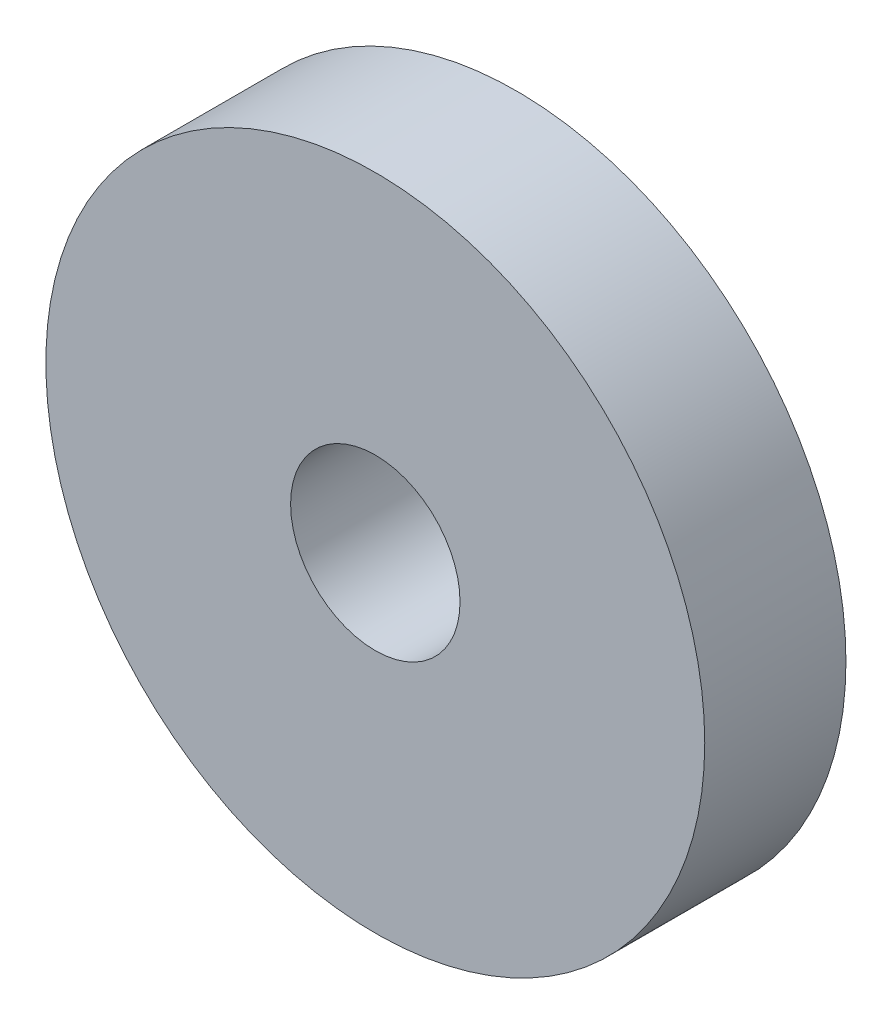
ISO-10303-21;
HEADER;
FILE_DESCRIPTION(('STEP AP214'),'2;1');
FILE_NAME('part.step','',(''),(''),'','','');
FILE_SCHEMA(('AUTOMOTIVE_DESIGN { 1 0 10303 214 1 1 1 1 }'));
ENDSEC;
DATA;
#1=APPLICATION_CONTEXT('core data for automotive mechanical design processes');
#2=APPLICATION_PROTOCOL_DEFINITION('international standard','automotive_design',2000,#1);
#3=PRODUCT_CONTEXT('',#1,'mechanical');
#4=PRODUCT('Part','Part','',(#3));
#5=PRODUCT_RELATED_PRODUCT_CATEGORY('part','',(#4));
#6=PRODUCT_DEFINITION_FORMATION('','',#4);
#7=PRODUCT_DEFINITION_CONTEXT('part definition',#1,'design');
#8=PRODUCT_DEFINITION('design','',#6,#7);
#9=PRODUCT_DEFINITION_SHAPE('','',#8);
#10=(LENGTH_UNIT() NAMED_UNIT(*) SI_UNIT(.MILLI.,.METRE.));
#11=(NAMED_UNIT(*) PLANE_ANGLE_UNIT() SI_UNIT($,.RADIAN.));
#12=(NAMED_UNIT(*) SI_UNIT($,.STERADIAN.) SOLID_ANGLE_UNIT());
#13=UNCERTAINTY_MEASURE_WITH_UNIT(LENGTH_MEASURE(1.E-05),#10,'distance_accuracy_value','');
#14=(GEOMETRIC_REPRESENTATION_CONTEXT(3) GLOBAL_UNCERTAINTY_ASSIGNED_CONTEXT((#13)) GLOBAL_UNIT_ASSIGNED_CONTEXT((#10,
#11,#12)) REPRESENTATION_CONTEXT('',''));
#15=CARTESIAN_POINT('',(0.,0.,0.));
#16=DIRECTION('',(0.,0.,1.));
#17=DIRECTION('',(1.,0.,0.));
#18=AXIS2_PLACEMENT_3D('',#15,#16,#17);
#19=CARTESIAN_POINT('',(0.,0.,136.));
#20=DIRECTION('',(0.,0.,-1.));
#21=DIRECTION('',(-1.,0.,0.));
#22=AXIS2_PLACEMENT_3D('',#19,#20,#21);
#23=CYLINDRICAL_SURFACE('',#22,35.);
#24=CARTESIAN_POINT('',(0.,0.,136.));
#25=DIRECTION('',(0.,0.,1.));
#26=DIRECTION('',(1.,0.,0.));
#27=AXIS2_PLACEMENT_3D('',#24,#25,#26);
#28=CIRCLE('',#27,35.);
#29=CARTESIAN_POINT('',(35.,0.,136.));
#30=VERTEX_POINT('',#29);
#31=EDGE_CURVE('E10',#30,#30,#28,.T.);
#32=ORIENTED_EDGE('',*,*,#31,.F.);
#33=EDGE_LOOP('',(#32));
#34=FACE_BOUND('',#33,.T.);
#35=CARTESIAN_POINT('',(0.,0.,121.));
#36=DIRECTION('',(0.,0.,1.));
#37=DIRECTION('',(1.,0.,0.));
#38=AXIS2_PLACEMENT_3D('',#35,#36,#37);
#39=CIRCLE('',#38,35.);
#40=CARTESIAN_POINT('',(35.,0.,121.));
#41=VERTEX_POINT('',#40);
#42=EDGE_CURVE('E48',#41,#41,#39,.T.);
#43=ORIENTED_EDGE('',*,*,#42,.T.);
#44=EDGE_LOOP('',(#43));
#45=FACE_BOUND('',#44,.T.);
#46=ADVANCED_FACE('F45',(#34,#45),#23,.T.);
#47=CARTESIAN_POINT('',(0.,0.,136.));
#48=DIRECTION('',(0.,0.,1.));
#49=DIRECTION('',(1.,0.,0.));
#50=AXIS2_PLACEMENT_3D('',#47,#48,#49);
#51=PLANE('',#50);
#52=CARTESIAN_POINT('',(0.,0.,136.));
#53=DIRECTION('',(0.,0.,1.));
#54=DIRECTION('',(1.,0.,0.));
#55=AXIS2_PLACEMENT_3D('',#52,#53,#54);
#56=CIRCLE('',#55,9.);
#57=CARTESIAN_POINT('',(9.,0.,136.));
#58=VERTEX_POINT('',#57);
#59=EDGE_CURVE('E106',#58,#58,#56,.T.);
#60=ORIENTED_EDGE('',*,*,#59,.F.);
#61=EDGE_LOOP('',(#60));
#62=FACE_BOUND('',#61,.T.);
#63=ORIENTED_EDGE('',*,*,#31,.T.);
#64=EDGE_LOOP('',(#63));
#65=FACE_BOUND('',#64,.T.);
#66=ADVANCED_FACE('F121',(#62,#65),#51,.T.);
#67=CARTESIAN_POINT('',(0.,0.,121.));
#68=DIRECTION('',(0.,0.,1.));
#69=DIRECTION('',(1.,0.,0.));
#70=AXIS2_PLACEMENT_3D('',#67,#68,#69);
#71=PLANE('',#70);
#72=CARTESIAN_POINT('',(0.,0.,121.));
#73=DIRECTION('',(0.,0.,-1.));
#74=DIRECTION('',(-1.,0.,0.));
#75=AXIS2_PLACEMENT_3D('',#72,#73,#74);
#76=CIRCLE('',#75,9.);
#77=CARTESIAN_POINT('',(-9.,0.,121.));
#78=VERTEX_POINT('',#77);
#79=EDGE_CURVE('E110',#78,#78,#76,.T.);
#80=ORIENTED_EDGE('',*,*,#79,.F.);
#81=EDGE_LOOP('',(#80));
#82=FACE_BOUND('',#81,.T.);
#83=CARTESIAN_POINT('',(11.7346024862847,-22.0160778930827,121.));
#84=DIRECTION('',(0.,0.,1.));
#85=DIRECTION('',(1.,0.,0.));
#86=AXIS2_PLACEMENT_3D('',#83,#84,#85);
#87=CIRCLE('',#86,4.);
#88=CARTESIAN_POINT('',(15.7346024862847,-22.0160778930827,121.));
#89=VERTEX_POINT('',#88);
#90=EDGE_CURVE('E78',#89,#89,#87,.F.);
#91=ORIENTED_EDGE('',*,*,#90,.F.);
#92=EDGE_LOOP('',(#91));
#93=FACE_BOUND('',#92,.T.);
#94=CARTESIAN_POINT('',(-11.7346024862847,-22.0160778930827,121.));
#95=DIRECTION('',(0.,0.,1.));
#96=DIRECTION('',(1.,0.,0.));
#97=AXIS2_PLACEMENT_3D('',#94,#95,#96);
#98=CIRCLE('',#97,4.);
#99=CARTESIAN_POINT('',(-7.73460248628473,-22.0160778930827,121.));
#100=VERTEX_POINT('',#99);
#101=EDGE_CURVE('E74',#100,#100,#98,.F.);
#102=ORIENTED_EDGE('',*,*,#101,.F.);
#103=EDGE_LOOP('',(#102));
#104=FACE_BOUND('',#103,.T.);
#105=CARTESIAN_POINT('',(-13.1267829415376,21.2154696132601,121.));
#106=DIRECTION('',(0.,0.,1.));
#107=DIRECTION('',(1.,0.,0.));
#108=AXIS2_PLACEMENT_3D('',#105,#106,#107);
#109=CIRCLE('',#108,4.);
#110=CARTESIAN_POINT('',(-9.12678294153757,21.2154696132601,121.));
#111=VERTEX_POINT('',#110);
#112=EDGE_CURVE('E70',#111,#111,#109,.F.);
#113=ORIENTED_EDGE('',*,*,#112,.F.);
#114=EDGE_LOOP('',(#113));
#115=FACE_BOUND('',#114,.T.);
#116=CARTESIAN_POINT('',(13.1267829415376,21.2154696132601,121.));
#117=DIRECTION('',(0.,0.,1.));
#118=DIRECTION('',(1.,0.,0.));
#119=AXIS2_PLACEMENT_3D('',#116,#117,#118);
#120=CIRCLE('',#119,4.);
#121=CARTESIAN_POINT('',(17.1267829415376,21.2154696132601,121.));
#122=VERTEX_POINT('',#121);
#123=EDGE_CURVE('E66',#122,#122,#120,.F.);
#124=ORIENTED_EDGE('',*,*,#123,.F.);
#125=EDGE_LOOP('',(#124));
#126=FACE_BOUND('',#125,.T.);
#127=CARTESIAN_POINT('',(24.9389792163046,0.67520141745148,121.));
#128=DIRECTION('',(0.,0.,1.));
#129=DIRECTION('',(1.,0.,0.));
#130=AXIS2_PLACEMENT_3D('',#127,#128,#129);
#131=CIRCLE('',#130,4.);
#132=CARTESIAN_POINT('',(28.9389792163047,0.67520141745148,121.));
#133=VERTEX_POINT('',#132);
#134=EDGE_CURVE('E62',#133,#133,#131,.F.);
#135=ORIENTED_EDGE('',*,*,#134,.F.);
#136=EDGE_LOOP('',(#135));
#137=FACE_BOUND('',#136,.T.);
#138=CARTESIAN_POINT('',(-24.9307498918574,0.930747621568032,121.));
#139=DIRECTION('',(0.,0.,1.));
#140=DIRECTION('',(1.,0.,0.));
#141=AXIS2_PLACEMENT_3D('',#138,#139,#140);
#142=CIRCLE('',#141,4.);
#143=CARTESIAN_POINT('',(-20.9307498918574,0.930747621568032,121.));
#144=VERTEX_POINT('',#143);
#145=EDGE_CURVE('E57',#144,#144,#142,.F.);
#146=ORIENTED_EDGE('',*,*,#145,.F.);
#147=EDGE_LOOP('',(#146));
#148=FACE_BOUND('',#147,.T.);
#149=ORIENTED_EDGE('',*,*,#42,.F.);
#150=EDGE_LOOP('',(#149));
#151=FACE_BOUND('',#150,.T.);
#152=ADVANCED_FACE('F117',(#82,#93,#104,#115,#126,#137,#148,#151),#71,.F.);
#153=CARTESIAN_POINT('',(13.1267829415376,21.2154696132601,102.));
#154=DIRECTION('',(0.,0.,1.));
#155=DIRECTION('',(1.,0.,0.));
#156=AXIS2_PLACEMENT_3D('',#153,#154,#155);
#157=CYLINDRICAL_SURFACE('',#156,4.);
#158=CARTESIAN_POINT('',(13.1267829415376,21.2154696132601,127.));
#159=DIRECTION('',(0.,0.,-1.));
#160=DIRECTION('',(-1.,0.,0.));
#161=AXIS2_PLACEMENT_3D('',#158,#159,#160);
#162=CIRCLE('',#161,4.);
#163=CARTESIAN_POINT('',(9.12678294153757,21.2154696132601,127.));
#164=VERTEX_POINT('',#163);
#165=EDGE_CURVE('E82',#164,#164,#162,.T.);
#166=ORIENTED_EDGE('',*,*,#165,.F.);
#167=EDGE_LOOP('',(#166));
#168=FACE_BOUND('',#167,.T.);
#169=ORIENTED_EDGE('',*,*,#123,.T.);
#170=EDGE_LOOP('',(#169));
#171=FACE_BOUND('',#170,.T.);
#172=ADVANCED_FACE('F120',(#168,#171),#157,.F.);
#173=CARTESIAN_POINT('',(13.1267829415376,21.2154696132601,127.));
#174=DIRECTION('',(0.,0.,-1.));
#175=DIRECTION('',(-1.,0.,0.));
#176=AXIS2_PLACEMENT_3D('',#173,#174,#175);
#177=PLANE('',#176);
#178=ORIENTED_EDGE('',*,*,#165,.T.);
#179=EDGE_LOOP('',(#178));
#180=FACE_BOUND('',#179,.T.);
#181=ADVANCED_FACE('F149',(#180),#177,.T.);
#182=CARTESIAN_POINT('',(-11.7346024862847,-22.0160778930827,102.));
#183=DIRECTION('',(0.,0.,1.));
#184=DIRECTION('',(1.,0.,0.));
#185=AXIS2_PLACEMENT_3D('',#182,#183,#184);
#186=CYLINDRICAL_SURFACE('',#185,4.);
#187=CARTESIAN_POINT('',(-11.7346024862847,-22.0160778930827,127.));
#188=DIRECTION('',(0.,0.,-1.));
#189=DIRECTION('',(-1.,0.,0.));
#190=AXIS2_PLACEMENT_3D('',#187,#188,#189);
#191=CIRCLE('',#190,4.);
#192=CARTESIAN_POINT('',(-15.7346024862847,-22.0160778930827,127.));
#193=VERTEX_POINT('',#192);
#194=EDGE_CURVE('E99',#193,#193,#191,.T.);
#195=ORIENTED_EDGE('',*,*,#194,.F.);
#196=EDGE_LOOP('',(#195));
#197=FACE_BOUND('',#196,.T.);
#198=ORIENTED_EDGE('',*,*,#101,.T.);
#199=EDGE_LOOP('',(#198));
#200=FACE_BOUND('',#199,.T.);
#201=ADVANCED_FACE('F153',(#197,#200),#186,.F.);
#202=CARTESIAN_POINT('',(-11.7346024862847,-22.0160778930827,127.));
#203=DIRECTION('',(0.,0.,-1.));
#204=DIRECTION('',(-1.,0.,0.));
#205=AXIS2_PLACEMENT_3D('',#202,#203,#204);
#206=PLANE('',#205);
#207=ORIENTED_EDGE('',*,*,#194,.T.);
#208=EDGE_LOOP('',(#207));
#209=FACE_BOUND('',#208,.T.);
#210=ADVANCED_FACE('F171',(#209),#206,.T.);
#211=CARTESIAN_POINT('',(24.9389792163046,0.67520141745148,102.));
#212=DIRECTION('',(0.,0.,1.));
#213=DIRECTION('',(1.,0.,0.));
#214=AXIS2_PLACEMENT_3D('',#211,#212,#213);
#215=CYLINDRICAL_SURFACE('',#214,4.);
#216=CARTESIAN_POINT('',(24.9389792163046,0.67520141745148,127.));
#217=DIRECTION('',(0.,0.,-1.));
#218=DIRECTION('',(-1.,0.,0.));
#219=AXIS2_PLACEMENT_3D('',#216,#217,#218);
#220=CIRCLE('',#219,4.);
#221=CARTESIAN_POINT('',(20.9389792163046,0.67520141745148,127.));
#222=VERTEX_POINT('',#221);
#223=EDGE_CURVE('E86',#222,#222,#220,.T.);
#224=ORIENTED_EDGE('',*,*,#223,.F.);
#225=EDGE_LOOP('',(#224));
#226=FACE_BOUND('',#225,.T.);
#227=ORIENTED_EDGE('',*,*,#134,.T.);
#228=EDGE_LOOP('',(#227));
#229=FACE_BOUND('',#228,.T.);
#230=ADVANCED_FACE('F167',(#226,#229),#215,.F.);
#231=CARTESIAN_POINT('',(24.9389792163046,0.67520141745148,127.));
#232=DIRECTION('',(0.,0.,-1.));
#233=DIRECTION('',(-1.,0.,0.));
#234=AXIS2_PLACEMENT_3D('',#231,#232,#233);
#235=PLANE('',#234);
#236=ORIENTED_EDGE('',*,*,#223,.T.);
#237=EDGE_LOOP('',(#236));
#238=FACE_BOUND('',#237,.T.);
#239=ADVANCED_FACE('F163',(#238),#235,.T.);
#240=CARTESIAN_POINT('',(-13.1267829415376,21.2154696132601,102.));
#241=DIRECTION('',(0.,0.,1.));
#242=DIRECTION('',(1.,0.,0.));
#243=AXIS2_PLACEMENT_3D('',#240,#241,#242);
#244=CYLINDRICAL_SURFACE('',#243,4.);
#245=CARTESIAN_POINT('',(-13.1267829415376,21.2154696132601,127.));
#246=DIRECTION('',(0.,0.,-1.));
#247=DIRECTION('',(-1.,0.,0.));
#248=AXIS2_PLACEMENT_3D('',#245,#246,#247);
#249=CIRCLE('',#248,4.);
#250=CARTESIAN_POINT('',(-17.1267829415376,21.2154696132601,127.));
#251=VERTEX_POINT('',#250);
#252=EDGE_CURVE('E87',#251,#251,#249,.T.);
#253=ORIENTED_EDGE('',*,*,#252,.F.);
#254=EDGE_LOOP('',(#253));
#255=FACE_BOUND('',#254,.T.);
#256=ORIENTED_EDGE('',*,*,#112,.T.);
#257=EDGE_LOOP('',(#256));
#258=FACE_BOUND('',#257,.T.);
#259=ADVANCED_FACE('F159',(#255,#258),#244,.F.);
#260=CARTESIAN_POINT('',(-13.1267829415376,21.2154696132601,127.));
#261=DIRECTION('',(0.,0.,-1.));
#262=DIRECTION('',(-1.,0.,0.));
#263=AXIS2_PLACEMENT_3D('',#260,#261,#262);
#264=PLANE('',#263);
#265=ORIENTED_EDGE('',*,*,#252,.T.);
#266=EDGE_LOOP('',(#265));
#267=FACE_BOUND('',#266,.T.);
#268=ADVANCED_FACE('F155',(#267),#264,.T.);
#269=CARTESIAN_POINT('',(-24.9307498918574,0.930747621568032,102.));
#270=DIRECTION('',(0.,0.,1.));
#271=DIRECTION('',(1.,0.,0.));
#272=AXIS2_PLACEMENT_3D('',#269,#270,#271);
#273=CYLINDRICAL_SURFACE('',#272,4.);
#274=CARTESIAN_POINT('',(-24.9307498918574,0.930747621568032,127.));
#275=DIRECTION('',(0.,0.,-1.));
#276=DIRECTION('',(-1.,0.,0.));
#277=AXIS2_PLACEMENT_3D('',#274,#275,#276);
#278=CIRCLE('',#277,4.);
#279=CARTESIAN_POINT('',(-28.9307498918574,0.930747621568032,127.));
#280=VERTEX_POINT('',#279);
#281=EDGE_CURVE('E91',#280,#280,#278,.T.);
#282=ORIENTED_EDGE('',*,*,#281,.F.);
#283=EDGE_LOOP('',(#282));
#284=FACE_BOUND('',#283,.T.);
#285=ORIENTED_EDGE('',*,*,#145,.T.);
#286=EDGE_LOOP('',(#285));
#287=FACE_BOUND('',#286,.T.);
#288=ADVANCED_FACE('F158',(#284,#287),#273,.F.);
#289=CARTESIAN_POINT('',(-24.9307498918574,0.930747621568032,127.));
#290=DIRECTION('',(0.,0.,-1.));
#291=DIRECTION('',(-1.,0.,0.));
#292=AXIS2_PLACEMENT_3D('',#289,#290,#291);
#293=PLANE('',#292);
#294=ORIENTED_EDGE('',*,*,#281,.T.);
#295=EDGE_LOOP('',(#294));
#296=FACE_BOUND('',#295,.T.);
#297=ADVANCED_FACE('F180',(#296),#293,.T.);
#298=CARTESIAN_POINT('',(11.7346024862847,-22.0160778930827,102.));
#299=DIRECTION('',(0.,0.,1.));
#300=DIRECTION('',(1.,0.,0.));
#301=AXIS2_PLACEMENT_3D('',#298,#299,#300);
#302=CYLINDRICAL_SURFACE('',#301,4.);
#303=CARTESIAN_POINT('',(11.7346024862847,-22.0160778930827,127.));
#304=DIRECTION('',(0.,0.,-1.));
#305=DIRECTION('',(-1.,0.,0.));
#306=AXIS2_PLACEMENT_3D('',#303,#304,#305);
#307=CIRCLE('',#306,4.);
#308=CARTESIAN_POINT('',(7.73460248628473,-22.0160778930827,127.));
#309=VERTEX_POINT('',#308);
#310=EDGE_CURVE('E95',#309,#309,#307,.T.);
#311=ORIENTED_EDGE('',*,*,#310,.F.);
#312=EDGE_LOOP('',(#311));
#313=FACE_BOUND('',#312,.T.);
#314=ORIENTED_EDGE('',*,*,#90,.T.);
#315=EDGE_LOOP('',(#314));
#316=FACE_BOUND('',#315,.T.);
#317=ADVANCED_FACE('F176',(#313,#316),#302,.F.);
#318=CARTESIAN_POINT('',(11.7346024862847,-22.0160778930827,127.));
#319=DIRECTION('',(0.,0.,-1.));
#320=DIRECTION('',(-1.,0.,0.));
#321=AXIS2_PLACEMENT_3D('',#318,#319,#320);
#322=PLANE('',#321);
#323=ORIENTED_EDGE('',*,*,#310,.T.);
#324=EDGE_LOOP('',(#323));
#325=FACE_BOUND('',#324,.T.);
#326=ADVANCED_FACE('F173',(#325),#322,.T.);
#327=CARTESIAN_POINT('',(0.,0.,167.));
#328=DIRECTION('',(0.,0.,-1.));
#329=DIRECTION('',(-1.,0.,0.));
#330=AXIS2_PLACEMENT_3D('',#327,#328,#329);
#331=CYLINDRICAL_SURFACE('',#330,9.);
#332=ORIENTED_EDGE('',*,*,#59,.T.);
#333=EDGE_LOOP('',(#332));
#334=FACE_BOUND('',#333,.T.);
#335=ORIENTED_EDGE('',*,*,#79,.T.);
#336=EDGE_LOOP('',(#335));
#337=FACE_BOUND('',#336,.T.);
#338=ADVANCED_FACE('F115',(#334,#337),#331,.F.);
#339=CLOSED_SHELL('',(#46,#66,#152,#172,#181,#201,#210,#230,#239,#259,#268,#288,#297,#317,#326,#338));
#340=MANIFOLD_SOLID_BREP('B2',#339);
#341=ADVANCED_BREP_SHAPE_REPRESENTATION('',(#18,#340),#14);
#342=SHAPE_DEFINITION_REPRESENTATION(#9,#341);
ENDSEC;
END-ISO-10303-21;
